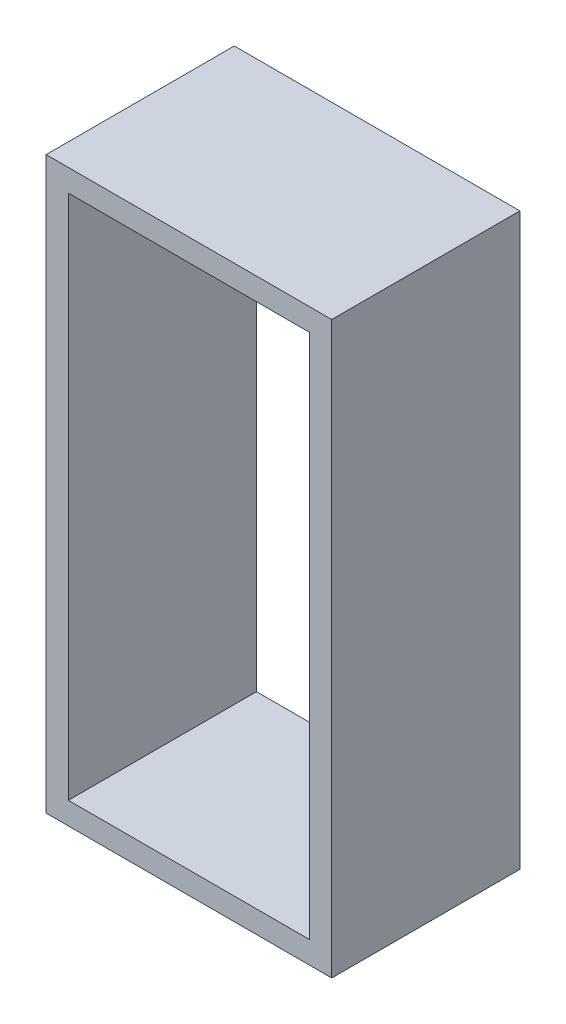
ISO-10303-21;
HEADER;
FILE_DESCRIPTION(('STEP AP214'),'2;1');
FILE_NAME('part.step','',(''),(''),'','','');
FILE_SCHEMA(('AUTOMOTIVE_DESIGN { 1 0 10303 214 1 1 1 1 }'));
ENDSEC;
DATA;
#1=APPLICATION_CONTEXT('core data for automotive mechanical design processes');
#2=APPLICATION_PROTOCOL_DEFINITION('international standard','automotive_design',2000,#1);
#3=PRODUCT_CONTEXT('',#1,'mechanical');
#4=PRODUCT('Part','Part','',(#3));
#5=PRODUCT_RELATED_PRODUCT_CATEGORY('part','',(#4));
#6=PRODUCT_DEFINITION_FORMATION('','',#4);
#7=PRODUCT_DEFINITION_CONTEXT('part definition',#1,'design');
#8=PRODUCT_DEFINITION('design','',#6,#7);
#9=PRODUCT_DEFINITION_SHAPE('','',#8);
#10=(LENGTH_UNIT() NAMED_UNIT(*) SI_UNIT(.MILLI.,.METRE.));
#11=(NAMED_UNIT(*) PLANE_ANGLE_UNIT() SI_UNIT($,.RADIAN.));
#12=(NAMED_UNIT(*) SI_UNIT($,.STERADIAN.) SOLID_ANGLE_UNIT());
#13=UNCERTAINTY_MEASURE_WITH_UNIT(LENGTH_MEASURE(1.E-05),#10,'distance_accuracy_value','');
#14=(GEOMETRIC_REPRESENTATION_CONTEXT(3) GLOBAL_UNCERTAINTY_ASSIGNED_CONTEXT((#13)) GLOBAL_UNIT_ASSIGNED_CONTEXT((#10,
#11,#12)) REPRESENTATION_CONTEXT('',''));
#15=CARTESIAN_POINT('',(0.,0.,0.));
#16=DIRECTION('',(0.,0.,1.));
#17=DIRECTION('',(1.,0.,0.));
#18=AXIS2_PLACEMENT_3D('',#15,#16,#17);
#19=CARTESIAN_POINT('',(0.,0.,6.35));
#20=DIRECTION('',(0.,0.,1.));
#21=DIRECTION('',(1.,0.,0.));
#22=AXIS2_PLACEMENT_3D('',#19,#20,#21);
#23=PLANE('',#22);
#24=DIRECTION('',(0.,-1.,0.));
#25=VECTOR('',#24,1.);
#26=CARTESIAN_POINT('',(-14.55,-5.25,6.35));
#27=LINE('',#26,#25);
#28=CARTESIAN_POINT('',(-14.55,-5.25,6.35));
#29=VERTEX_POINT('',#28);
#30=CARTESIAN_POINT('',(-14.55,-43.75,6.35));
#31=VERTEX_POINT('',#30);
#32=EDGE_CURVE('E145',#29,#31,#27,.T.);
#33=ORIENTED_EDGE('',*,*,#32,.T.);
#34=DIRECTION('',(1.,0.,0.));
#35=VECTOR('',#34,1.);
#36=CARTESIAN_POINT('',(-14.55,-43.75,6.35));
#37=LINE('',#36,#35);
#38=CARTESIAN_POINT('',(4.73,-43.75,6.35));
#39=VERTEX_POINT('',#38);
#40=EDGE_CURVE('E144',#31,#39,#37,.T.);
#41=ORIENTED_EDGE('',*,*,#40,.T.);
#42=DIRECTION('',(0.,1.,0.));
#43=VECTOR('',#42,1.);
#44=CARTESIAN_POINT('',(4.73,-43.75,6.35));
#45=LINE('',#44,#43);
#46=CARTESIAN_POINT('',(4.73,-5.25,6.35));
#47=VERTEX_POINT('',#46);
#48=EDGE_CURVE('E149',#39,#47,#45,.T.);
#49=ORIENTED_EDGE('',*,*,#48,.T.);
#50=DIRECTION('',(-1.,0.,0.));
#51=VECTOR('',#50,1.);
#52=CARTESIAN_POINT('',(4.73,-5.25,6.35));
#53=LINE('',#52,#51);
#54=EDGE_CURVE('E148',#47,#29,#53,.T.);
#55=ORIENTED_EDGE('',*,*,#54,.T.);
#56=EDGE_LOOP('',(#33,#41,#49,#55));
#57=FACE_BOUND('',#56,.T.);
#58=DIRECTION('',(1.,0.,0.));
#59=VECTOR('',#58,1.);
#60=CARTESIAN_POINT('',(-13.05,-42.25,6.35));
#61=LINE('',#60,#59);
#62=CARTESIAN_POINT('',(-13.05,-42.25,6.35));
#63=VERTEX_POINT('',#62);
#64=CARTESIAN_POINT('',(3.23,-42.25,6.35));
#65=VERTEX_POINT('',#64);
#66=EDGE_CURVE('E114',#63,#65,#61,.T.);
#67=ORIENTED_EDGE('',*,*,#66,.F.);
#68=DIRECTION('',(0.,-1.,0.));
#69=VECTOR('',#68,1.);
#70=CARTESIAN_POINT('',(-13.05,-6.75,6.35));
#71=LINE('',#70,#69);
#72=CARTESIAN_POINT('',(-13.05,-6.75,6.35));
#73=VERTEX_POINT('',#72);
#74=EDGE_CURVE('E107',#73,#63,#71,.T.);
#75=ORIENTED_EDGE('',*,*,#74,.F.);
#76=DIRECTION('',(-1.,0.,0.));
#77=VECTOR('',#76,1.);
#78=CARTESIAN_POINT('',(3.23,-6.75,6.35));
#79=LINE('',#78,#77);
#80=CARTESIAN_POINT('',(3.23,-6.75,6.35));
#81=VERTEX_POINT('',#80);
#82=EDGE_CURVE('E126',#81,#73,#79,.T.);
#83=ORIENTED_EDGE('',*,*,#82,.F.);
#84=DIRECTION('',(0.,1.,0.));
#85=VECTOR('',#84,1.);
#86=CARTESIAN_POINT('',(3.23,-42.25,6.35));
#87=LINE('',#86,#85);
#88=EDGE_CURVE('E128',#65,#81,#87,.T.);
#89=ORIENTED_EDGE('',*,*,#88,.F.);
#90=EDGE_LOOP('',(#67,#75,#83,#89));
#91=FACE_BOUND('',#90,.T.);
#92=ADVANCED_FACE('F41',(#57,#91),#23,.T.);
#93=CARTESIAN_POINT('',(0.,0.,-6.35));
#94=DIRECTION('',(0.,0.,1.));
#95=DIRECTION('',(1.,0.,0.));
#96=AXIS2_PLACEMENT_3D('',#93,#94,#95);
#97=PLANE('',#96);
#98=DIRECTION('',(0.,-1.,0.));
#99=VECTOR('',#98,1.);
#100=CARTESIAN_POINT('',(-14.55,-5.25,-6.35));
#101=LINE('',#100,#99);
#102=CARTESIAN_POINT('',(-14.55,-5.25,-6.35));
#103=VERTEX_POINT('',#102);
#104=CARTESIAN_POINT('',(-14.55,-43.75,-6.35));
#105=VERTEX_POINT('',#104);
#106=EDGE_CURVE('E122',#103,#105,#101,.T.);
#107=ORIENTED_EDGE('',*,*,#106,.F.);
#108=DIRECTION('',(-1.,0.,0.));
#109=VECTOR('',#108,1.);
#110=CARTESIAN_POINT('',(4.73,-5.25,-6.35));
#111=LINE('',#110,#109);
#112=CARTESIAN_POINT('',(4.73,-5.25,-6.35));
#113=VERTEX_POINT('',#112);
#114=EDGE_CURVE('E147',#113,#103,#111,.T.);
#115=ORIENTED_EDGE('',*,*,#114,.F.);
#116=DIRECTION('',(0.,1.,0.));
#117=VECTOR('',#116,1.);
#118=CARTESIAN_POINT('',(4.73,-43.75,-6.35));
#119=LINE('',#118,#117);
#120=CARTESIAN_POINT('',(4.73,-43.75,-6.35));
#121=VERTEX_POINT('',#120);
#122=EDGE_CURVE('E160',#121,#113,#119,.T.);
#123=ORIENTED_EDGE('',*,*,#122,.F.);
#124=DIRECTION('',(1.,0.,0.));
#125=VECTOR('',#124,1.);
#126=CARTESIAN_POINT('',(-14.55,-43.75,-6.35));
#127=LINE('',#126,#125);
#128=EDGE_CURVE('E151',#105,#121,#127,.T.);
#129=ORIENTED_EDGE('',*,*,#128,.F.);
#130=EDGE_LOOP('',(#107,#115,#123,#129));
#131=FACE_BOUND('',#130,.T.);
#132=DIRECTION('',(0.,-1.,0.));
#133=VECTOR('',#132,1.);
#134=CARTESIAN_POINT('',(-13.05,-6.75,-6.35));
#135=LINE('',#134,#133);
#136=CARTESIAN_POINT('',(-13.05,-6.75,-6.35));
#137=VERTEX_POINT('',#136);
#138=CARTESIAN_POINT('',(-13.05,-42.25,-6.35));
#139=VERTEX_POINT('',#138);
#140=EDGE_CURVE('E64',#137,#139,#135,.T.);
#141=ORIENTED_EDGE('',*,*,#140,.T.);
#142=DIRECTION('',(1.,0.,0.));
#143=VECTOR('',#142,1.);
#144=CARTESIAN_POINT('',(-13.05,-42.25,-6.35));
#145=LINE('',#144,#143);
#146=CARTESIAN_POINT('',(3.23,-42.25,-6.35));
#147=VERTEX_POINT('',#146);
#148=EDGE_CURVE('E123',#139,#147,#145,.T.);
#149=ORIENTED_EDGE('',*,*,#148,.T.);
#150=DIRECTION('',(0.,1.,0.));
#151=VECTOR('',#150,1.);
#152=CARTESIAN_POINT('',(3.23,-42.25,-6.35));
#153=LINE('',#152,#151);
#154=CARTESIAN_POINT('',(3.23,-6.75,-6.35));
#155=VERTEX_POINT('',#154);
#156=EDGE_CURVE('E132',#147,#155,#153,.T.);
#157=ORIENTED_EDGE('',*,*,#156,.T.);
#158=DIRECTION('',(-1.,0.,0.));
#159=VECTOR('',#158,1.);
#160=CARTESIAN_POINT('',(3.23,-6.75,-6.35));
#161=LINE('',#160,#159);
#162=EDGE_CURVE('E113',#155,#137,#161,.T.);
#163=ORIENTED_EDGE('',*,*,#162,.T.);
#164=EDGE_LOOP('',(#141,#149,#157,#163));
#165=FACE_BOUND('',#164,.T.);
#166=ADVANCED_FACE('F172',(#131,#165),#97,.F.);
#167=CARTESIAN_POINT('',(-14.55,-5.25,6.35));
#168=DIRECTION('',(1.,0.,0.));
#169=DIRECTION('',(0.,0.,-1.));
#170=AXIS2_PLACEMENT_3D('',#167,#168,#169);
#171=PLANE('',#170);
#172=ORIENTED_EDGE('',*,*,#106,.T.);
#173=DIRECTION('',(0.,0.,-1.));
#174=VECTOR('',#173,1.);
#175=CARTESIAN_POINT('',(-14.55,-43.75,6.35));
#176=LINE('',#175,#174);
#177=EDGE_CURVE('E11',#31,#105,#176,.T.);
#178=ORIENTED_EDGE('',*,*,#177,.F.);
#179=ORIENTED_EDGE('',*,*,#32,.F.);
#180=DIRECTION('',(0.,0.,-1.));
#181=VECTOR('',#180,1.);
#182=CARTESIAN_POINT('',(-14.55,-5.25,6.35));
#183=LINE('',#182,#181);
#184=EDGE_CURVE('E155',#29,#103,#183,.T.);
#185=ORIENTED_EDGE('',*,*,#184,.T.);
#186=EDGE_LOOP('',(#172,#178,#179,#185));
#187=FACE_BOUND('',#186,.T.);
#188=ADVANCED_FACE('F43',(#187),#171,.F.);
#189=CARTESIAN_POINT('',(-14.55,-43.75,6.35));
#190=DIRECTION('',(0.,1.,0.));
#191=DIRECTION('',(0.,0.,1.));
#192=AXIS2_PLACEMENT_3D('',#189,#190,#191);
#193=PLANE('',#192);
#194=ORIENTED_EDGE('',*,*,#128,.T.);
#195=DIRECTION('',(0.,0.,-1.));
#196=VECTOR('',#195,1.);
#197=CARTESIAN_POINT('',(4.73,-43.75,6.35));
#198=LINE('',#197,#196);
#199=EDGE_CURVE('E47',#39,#121,#198,.T.);
#200=ORIENTED_EDGE('',*,*,#199,.F.);
#201=ORIENTED_EDGE('',*,*,#40,.F.);
#202=ORIENTED_EDGE('',*,*,#177,.T.);
#203=EDGE_LOOP('',(#194,#200,#201,#202));
#204=FACE_BOUND('',#203,.T.);
#205=ADVANCED_FACE('F184',(#204),#193,.F.);
#206=CARTESIAN_POINT('',(4.73,-43.75,6.35));
#207=DIRECTION('',(-1.,0.,0.));
#208=DIRECTION('',(0.,0.,1.));
#209=AXIS2_PLACEMENT_3D('',#206,#207,#208);
#210=PLANE('',#209);
#211=ORIENTED_EDGE('',*,*,#122,.T.);
#212=DIRECTION('',(0.,0.,-1.));
#213=VECTOR('',#212,1.);
#214=CARTESIAN_POINT('',(4.73,-5.25,6.35));
#215=LINE('',#214,#213);
#216=EDGE_CURVE('E165',#47,#113,#215,.T.);
#217=ORIENTED_EDGE('',*,*,#216,.F.);
#218=ORIENTED_EDGE('',*,*,#48,.F.);
#219=ORIENTED_EDGE('',*,*,#199,.T.);
#220=EDGE_LOOP('',(#211,#217,#218,#219));
#221=FACE_BOUND('',#220,.T.);
#222=ADVANCED_FACE('F170',(#221),#210,.F.);
#223=CARTESIAN_POINT('',(4.73,-5.25,6.35));
#224=DIRECTION('',(0.,-1.,0.));
#225=DIRECTION('',(0.,0.,-1.));
#226=AXIS2_PLACEMENT_3D('',#223,#224,#225);
#227=PLANE('',#226);
#228=ORIENTED_EDGE('',*,*,#114,.T.);
#229=ORIENTED_EDGE('',*,*,#184,.F.);
#230=ORIENTED_EDGE('',*,*,#54,.F.);
#231=ORIENTED_EDGE('',*,*,#216,.T.);
#232=EDGE_LOOP('',(#228,#229,#230,#231));
#233=FACE_BOUND('',#232,.T.);
#234=ADVANCED_FACE('F177',(#233),#227,.F.);
#235=CARTESIAN_POINT('',(-13.05,-6.75,6.35));
#236=DIRECTION('',(1.,0.,0.));
#237=DIRECTION('',(0.,0.,-1.));
#238=AXIS2_PLACEMENT_3D('',#235,#236,#237);
#239=PLANE('',#238);
#240=ORIENTED_EDGE('',*,*,#140,.F.);
#241=DIRECTION('',(0.,0.,-1.));
#242=VECTOR('',#241,1.);
#243=CARTESIAN_POINT('',(-13.05,-6.75,6.35));
#244=LINE('',#243,#242);
#245=EDGE_CURVE('E106',#73,#137,#244,.T.);
#246=ORIENTED_EDGE('',*,*,#245,.F.);
#247=ORIENTED_EDGE('',*,*,#74,.T.);
#248=DIRECTION('',(0.,0.,-1.));
#249=VECTOR('',#248,1.);
#250=CARTESIAN_POINT('',(-13.05,-42.25,6.35));
#251=LINE('',#250,#249);
#252=EDGE_CURVE('E109',#63,#139,#251,.T.);
#253=ORIENTED_EDGE('',*,*,#252,.T.);
#254=EDGE_LOOP('',(#240,#246,#247,#253));
#255=FACE_BOUND('',#254,.T.);
#256=ADVANCED_FACE('F108',(#255),#239,.T.);
#257=CARTESIAN_POINT('',(-13.05,-42.25,6.35));
#258=DIRECTION('',(0.,1.,0.));
#259=DIRECTION('',(0.,0.,1.));
#260=AXIS2_PLACEMENT_3D('',#257,#258,#259);
#261=PLANE('',#260);
#262=ORIENTED_EDGE('',*,*,#148,.F.);
#263=ORIENTED_EDGE('',*,*,#252,.F.);
#264=ORIENTED_EDGE('',*,*,#66,.T.);
#265=DIRECTION('',(0.,0.,-1.));
#266=VECTOR('',#265,1.);
#267=CARTESIAN_POINT('',(3.23,-42.25,6.35));
#268=LINE('',#267,#266);
#269=EDGE_CURVE('E121',#65,#147,#268,.T.);
#270=ORIENTED_EDGE('',*,*,#269,.T.);
#271=EDGE_LOOP('',(#262,#263,#264,#270));
#272=FACE_BOUND('',#271,.T.);
#273=ADVANCED_FACE('F118',(#272),#261,.T.);
#274=CARTESIAN_POINT('',(3.23,-42.25,6.35));
#275=DIRECTION('',(-1.,0.,0.));
#276=DIRECTION('',(0.,0.,1.));
#277=AXIS2_PLACEMENT_3D('',#274,#275,#276);
#278=PLANE('',#277);
#279=ORIENTED_EDGE('',*,*,#156,.F.);
#280=ORIENTED_EDGE('',*,*,#269,.F.);
#281=ORIENTED_EDGE('',*,*,#88,.T.);
#282=DIRECTION('',(0.,0.,-1.));
#283=VECTOR('',#282,1.);
#284=CARTESIAN_POINT('',(3.23,-6.75,6.35));
#285=LINE('',#284,#283);
#286=EDGE_CURVE('E57',#81,#155,#285,.T.);
#287=ORIENTED_EDGE('',*,*,#286,.T.);
#288=EDGE_LOOP('',(#279,#280,#281,#287));
#289=FACE_BOUND('',#288,.T.);
#290=ADVANCED_FACE('F208',(#289),#278,.T.);
#291=CARTESIAN_POINT('',(3.23,-6.75,6.35));
#292=DIRECTION('',(0.,-1.,0.));
#293=DIRECTION('',(0.,0.,-1.));
#294=AXIS2_PLACEMENT_3D('',#291,#292,#293);
#295=PLANE('',#294);
#296=ORIENTED_EDGE('',*,*,#162,.F.);
#297=ORIENTED_EDGE('',*,*,#286,.F.);
#298=ORIENTED_EDGE('',*,*,#82,.T.);
#299=ORIENTED_EDGE('',*,*,#245,.T.);
#300=EDGE_LOOP('',(#296,#297,#298,#299));
#301=FACE_BOUND('',#300,.T.);
#302=ADVANCED_FACE('F212',(#301),#295,.T.);
#303=CLOSED_SHELL('',(#92,#166,#188,#205,#222,#234,#256,#273,#290,#302));
#304=MANIFOLD_SOLID_BREP('B2',#303);
#305=ADVANCED_BREP_SHAPE_REPRESENTATION('',(#18,#304),#14);
#306=SHAPE_DEFINITION_REPRESENTATION(#9,#305);
ENDSEC;
END-ISO-10303-21;
